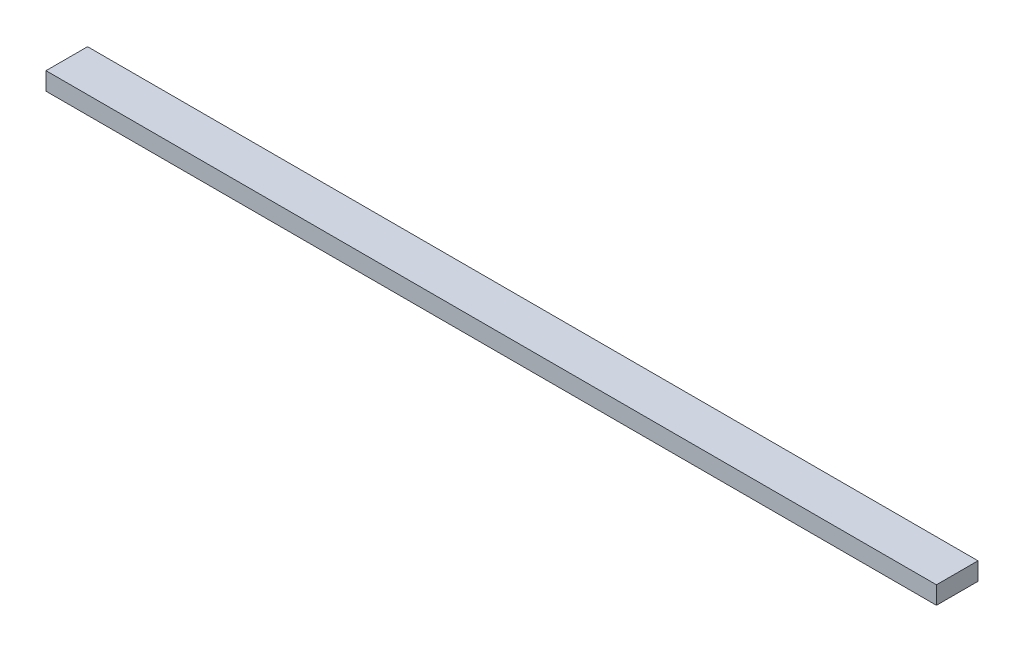
ISO-10303-21;
HEADER;
FILE_DESCRIPTION(('STEP AP214'),'2;1');
FILE_NAME('part.step','',(''),(''),'','','');
FILE_SCHEMA(('AUTOMOTIVE_DESIGN { 1 0 10303 214 1 1 1 1 }'));
ENDSEC;
DATA;
#1=APPLICATION_CONTEXT('core data for automotive mechanical design processes');
#2=APPLICATION_PROTOCOL_DEFINITION('international standard','automotive_design',2000,#1);
#3=PRODUCT_CONTEXT('',#1,'mechanical');
#4=PRODUCT('Part','Part','',(#3));
#5=PRODUCT_RELATED_PRODUCT_CATEGORY('part','',(#4));
#6=PRODUCT_DEFINITION_FORMATION('','',#4);
#7=PRODUCT_DEFINITION_CONTEXT('part definition',#1,'design');
#8=PRODUCT_DEFINITION('design','',#6,#7);
#9=PRODUCT_DEFINITION_SHAPE('','',#8);
#10=(LENGTH_UNIT() NAMED_UNIT(*) SI_UNIT(.MILLI.,.METRE.));
#11=(NAMED_UNIT(*) PLANE_ANGLE_UNIT() SI_UNIT($,.RADIAN.));
#12=(NAMED_UNIT(*) SI_UNIT($,.STERADIAN.) SOLID_ANGLE_UNIT());
#13=UNCERTAINTY_MEASURE_WITH_UNIT(LENGTH_MEASURE(1.E-05),#10,'distance_accuracy_value','');
#14=(GEOMETRIC_REPRESENTATION_CONTEXT(3) GLOBAL_UNCERTAINTY_ASSIGNED_CONTEXT((#13)) GLOBAL_UNIT_ASSIGNED_CONTEXT((#10,
#11,#12)) REPRESENTATION_CONTEXT('',''));
#15=CARTESIAN_POINT('',(0.,0.,0.));
#16=DIRECTION('',(0.,0.,1.));
#17=DIRECTION('',(1.,0.,0.));
#18=AXIS2_PLACEMENT_3D('',#15,#16,#17);
#19=CARTESIAN_POINT('',(476.250000000001,-9.52499999999826,-22.2249999999993));
#20=DIRECTION('',(0.,0.,1.));
#21=DIRECTION('',(1.,0.,0.));
#22=AXIS2_PLACEMENT_3D('',#19,#20,#21);
#23=PLANE('',#22);
#24=DIRECTION('',(0.,1.,0.));
#25=VECTOR('',#24,1.);
#26=CARTESIAN_POINT('',(-476.249999999998,-9.52500000000137,-22.2250000000001));
#27=LINE('',#26,#25);
#28=CARTESIAN_POINT('',(-476.249999999998,-9.52500000000137,-22.2250000000001));
#29=VERTEX_POINT('',#28);
#30=CARTESIAN_POINT('',(-476.249999999999,9.52499999999865,-22.2250000000001));
#31=VERTEX_POINT('',#30);
#32=EDGE_CURVE('E119',#29,#31,#27,.T.);
#33=ORIENTED_EDGE('',*,*,#32,.T.);
#34=DIRECTION('',(-1.,0.,0.));
#35=VECTOR('',#34,1.);
#36=CARTESIAN_POINT('',(476.250000000001,9.52500000000173,-22.2249999999993));
#37=LINE('',#36,#35);
#38=CARTESIAN_POINT('',(476.250000000001,9.52500000000173,-22.2249999999993));
#39=VERTEX_POINT('',#38);
#40=EDGE_CURVE('E11',#39,#31,#37,.T.);
#41=ORIENTED_EDGE('',*,*,#40,.F.);
#42=DIRECTION('',(0.,1.,0.));
#43=VECTOR('',#42,1.);
#44=CARTESIAN_POINT('',(476.250000000001,-9.52499999999826,-22.2249999999993));
#45=LINE('',#44,#43);
#46=CARTESIAN_POINT('',(476.250000000001,-9.52499999999826,-22.2249999999993));
#47=VERTEX_POINT('',#46);
#48=EDGE_CURVE('E100',#47,#39,#45,.T.);
#49=ORIENTED_EDGE('',*,*,#48,.F.);
#50=DIRECTION('',(-1.,0.,0.));
#51=VECTOR('',#50,1.);
#52=CARTESIAN_POINT('',(476.250000000001,-9.52499999999826,-22.2249999999993));
#53=LINE('',#52,#51);
#54=EDGE_CURVE('E115',#47,#29,#53,.T.);
#55=ORIENTED_EDGE('',*,*,#54,.T.);
#56=EDGE_LOOP('',(#33,#41,#49,#55));
#57=FACE_BOUND('',#56,.T.);
#58=ADVANCED_FACE('F46',(#57),#23,.F.);
#59=CARTESIAN_POINT('',(476.250000000002,9.52500000000176,22.2250000000007));
#60=DIRECTION('',(0.,-1.,0.));
#61=DIRECTION('',(0.,0.,-1.));
#62=AXIS2_PLACEMENT_3D('',#59,#60,#61);
#63=PLANE('',#62);
#64=DIRECTION('',(0.,0.,1.));
#65=VECTOR('',#64,1.);
#66=CARTESIAN_POINT('',(-476.249999999998,9.52499999999865,22.2249999999999));
#67=LINE('',#66,#65);
#68=CARTESIAN_POINT('',(-476.249999999998,9.52499999999865,22.2249999999999));
#69=VERTEX_POINT('',#68);
#70=EDGE_CURVE('E105',#31,#69,#67,.T.);
#71=ORIENTED_EDGE('',*,*,#70,.T.);
#72=DIRECTION('',(-1.,0.,0.));
#73=VECTOR('',#72,1.);
#74=CARTESIAN_POINT('',(476.250000000002,9.52500000000176,22.2250000000007));
#75=LINE('',#74,#73);
#76=CARTESIAN_POINT('',(476.250000000002,9.52500000000176,22.2250000000007));
#77=VERTEX_POINT('',#76);
#78=EDGE_CURVE('E55',#77,#69,#75,.T.);
#79=ORIENTED_EDGE('',*,*,#78,.F.);
#80=DIRECTION('',(0.,0.,1.));
#81=VECTOR('',#80,1.);
#82=CARTESIAN_POINT('',(476.250000000002,9.52500000000176,22.2250000000007));
#83=LINE('',#82,#81);
#84=EDGE_CURVE('E95',#39,#77,#83,.T.);
#85=ORIENTED_EDGE('',*,*,#84,.F.);
#86=ORIENTED_EDGE('',*,*,#40,.T.);
#87=EDGE_LOOP('',(#71,#79,#85,#86));
#88=FACE_BOUND('',#87,.T.);
#89=ADVANCED_FACE('F104',(#88),#63,.F.);
#90=CARTESIAN_POINT('',(476.250000000002,-9.52499999999826,22.2250000000007));
#91=DIRECTION('',(0.,0.,-1.));
#92=DIRECTION('',(-1.,0.,0.));
#93=AXIS2_PLACEMENT_3D('',#90,#91,#92);
#94=PLANE('',#93);
#95=DIRECTION('',(0.,-1.,0.));
#96=VECTOR('',#95,1.);
#97=CARTESIAN_POINT('',(-476.249999999998,-9.52500000000134,22.2249999999999));
#98=LINE('',#97,#96);
#99=CARTESIAN_POINT('',(-476.249999999998,-9.52500000000134,22.2249999999999));
#100=VERTEX_POINT('',#99);
#101=EDGE_CURVE('E82',#69,#100,#98,.T.);
#102=ORIENTED_EDGE('',*,*,#101,.T.);
#103=DIRECTION('',(-1.,0.,0.));
#104=VECTOR('',#103,1.);
#105=CARTESIAN_POINT('',(476.250000000002,-9.52499999999826,22.2250000000007));
#106=LINE('',#105,#104);
#107=CARTESIAN_POINT('',(476.250000000002,-9.52499999999826,22.2250000000007));
#108=VERTEX_POINT('',#107);
#109=EDGE_CURVE('E107',#108,#100,#106,.T.);
#110=ORIENTED_EDGE('',*,*,#109,.F.);
#111=DIRECTION('',(0.,-1.,0.));
#112=VECTOR('',#111,1.);
#113=CARTESIAN_POINT('',(476.250000000002,-9.52499999999826,22.2250000000007));
#114=LINE('',#113,#112);
#115=EDGE_CURVE('E98',#77,#108,#114,.T.);
#116=ORIENTED_EDGE('',*,*,#115,.F.);
#117=ORIENTED_EDGE('',*,*,#78,.T.);
#118=EDGE_LOOP('',(#102,#110,#116,#117));
#119=FACE_BOUND('',#118,.T.);
#120=ADVANCED_FACE('F108',(#119),#94,.F.);
#121=CARTESIAN_POINT('',(476.250000000002,-9.52499999999826,22.2250000000007));
#122=DIRECTION('',(0.,1.,0.));
#123=DIRECTION('',(0.,0.,1.));
#124=AXIS2_PLACEMENT_3D('',#121,#122,#123);
#125=PLANE('',#124);
#126=DIRECTION('',(0.,0.,-1.));
#127=VECTOR('',#126,1.);
#128=CARTESIAN_POINT('',(-476.249999999998,-9.52500000000134,22.2249999999999));
#129=LINE('',#128,#127);
#130=EDGE_CURVE('E88',#100,#29,#129,.T.);
#131=ORIENTED_EDGE('',*,*,#130,.T.);
#132=ORIENTED_EDGE('',*,*,#54,.F.);
#133=DIRECTION('',(0.,0.,-1.));
#134=VECTOR('',#133,1.);
#135=CARTESIAN_POINT('',(476.250000000002,-9.52499999999826,22.2250000000007));
#136=LINE('',#135,#134);
#137=EDGE_CURVE('E65',#108,#47,#136,.T.);
#138=ORIENTED_EDGE('',*,*,#137,.F.);
#139=ORIENTED_EDGE('',*,*,#109,.T.);
#140=EDGE_LOOP('',(#131,#132,#138,#139));
#141=FACE_BOUND('',#140,.T.);
#142=ADVANCED_FACE('F133',(#141),#125,.F.);
#143=CARTESIAN_POINT('',(476.25,1.55431223447522E-12,6.66133814775094E-13));
#144=DIRECTION('',(-1.,0.,0.));
#145=DIRECTION('',(0.,0.,1.));
#146=AXIS2_PLACEMENT_3D('',#143,#144,#145);
#147=PLANE('',#146);
#148=ORIENTED_EDGE('',*,*,#48,.T.);
#149=ORIENTED_EDGE('',*,*,#84,.T.);
#150=ORIENTED_EDGE('',*,*,#115,.T.);
#151=ORIENTED_EDGE('',*,*,#137,.T.);
#152=EDGE_LOOP('',(#148,#149,#150,#151));
#153=FACE_BOUND('',#152,.T.);
#154=ADVANCED_FACE('F96',(#153),#147,.F.);
#155=CARTESIAN_POINT('',(-476.249999999998,-1.36002320516582E-12,0.));
#156=DIRECTION('',(-1.,0.,0.));
#157=DIRECTION('',(0.,0.,1.));
#158=AXIS2_PLACEMENT_3D('',#155,#156,#157);
#159=PLANE('',#158);
#160=ORIENTED_EDGE('',*,*,#32,.F.);
#161=ORIENTED_EDGE('',*,*,#130,.F.);
#162=ORIENTED_EDGE('',*,*,#101,.F.);
#163=ORIENTED_EDGE('',*,*,#70,.F.);
#164=EDGE_LOOP('',(#160,#161,#162,#163));
#165=FACE_BOUND('',#164,.T.);
#166=ADVANCED_FACE('F136',(#165),#159,.T.);
#167=CLOSED_SHELL('',(#58,#89,#120,#142,#154,#166));
#168=MANIFOLD_SOLID_BREP('B2',#167);
#169=ADVANCED_BREP_SHAPE_REPRESENTATION('',(#18,#168),#14);
#170=SHAPE_DEFINITION_REPRESENTATION(#9,#169);
ENDSEC;
END-ISO-10303-21;
